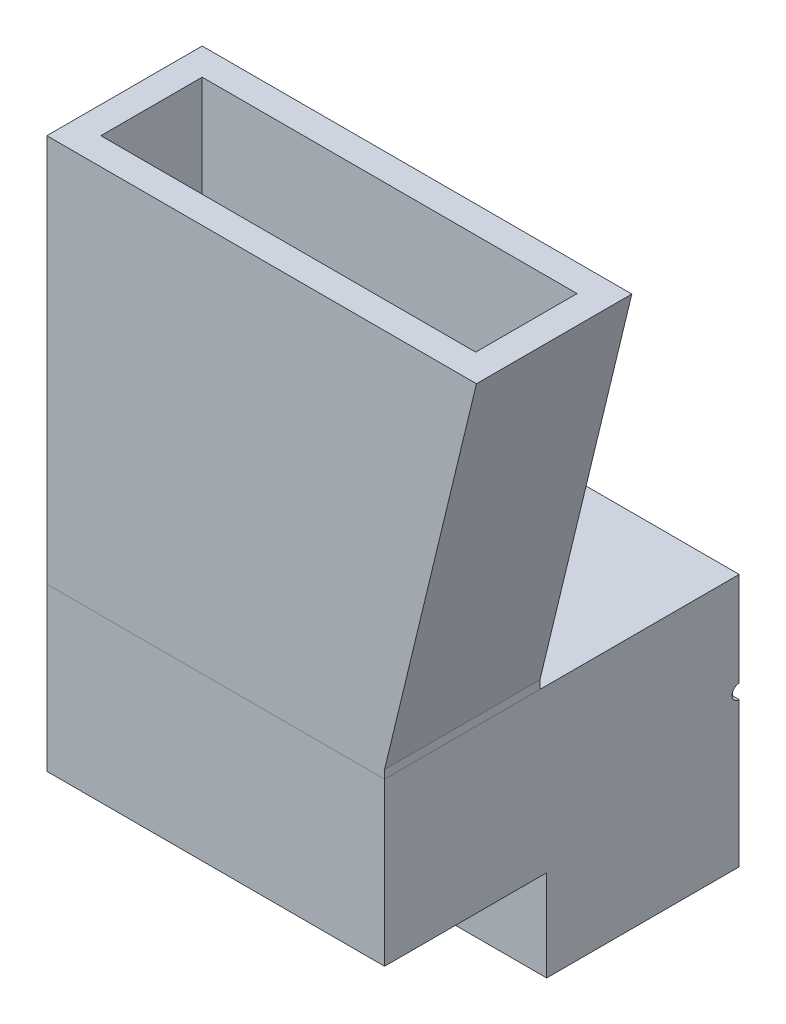
ISO-10303-21;
HEADER;
FILE_DESCRIPTION(('STEP AP214'),'2;1');
FILE_NAME('part.step','',(''),(''),'','','');
FILE_SCHEMA(('AUTOMOTIVE_DESIGN { 1 0 10303 214 1 1 1 1 }'));
ENDSEC;
DATA;
#1=APPLICATION_CONTEXT('core data for automotive mechanical design processes');
#2=APPLICATION_PROTOCOL_DEFINITION('international standard','automotive_design',2000,#1);
#3=PRODUCT_CONTEXT('',#1,'mechanical');
#4=PRODUCT('Part','Part','',(#3));
#5=PRODUCT_RELATED_PRODUCT_CATEGORY('part','',(#4));
#6=PRODUCT_DEFINITION_FORMATION('','',#4);
#7=PRODUCT_DEFINITION_CONTEXT('part definition',#1,'design');
#8=PRODUCT_DEFINITION('design','',#6,#7);
#9=PRODUCT_DEFINITION_SHAPE('','',#8);
#10=(LENGTH_UNIT() NAMED_UNIT(*) SI_UNIT(.MILLI.,.METRE.));
#11=(NAMED_UNIT(*) PLANE_ANGLE_UNIT() SI_UNIT($,.RADIAN.));
#12=(NAMED_UNIT(*) SI_UNIT($,.STERADIAN.) SOLID_ANGLE_UNIT());
#13=UNCERTAINTY_MEASURE_WITH_UNIT(LENGTH_MEASURE(1.E-05),#10,'distance_accuracy_value','');
#14=(GEOMETRIC_REPRESENTATION_CONTEXT(3) GLOBAL_UNCERTAINTY_ASSIGNED_CONTEXT((#13)) GLOBAL_UNIT_ASSIGNED_CONTEXT((#10,
#11,#12)) REPRESENTATION_CONTEXT('',''));
#15=CARTESIAN_POINT('',(0.,0.,0.));
#16=DIRECTION('',(0.,0.,1.));
#17=DIRECTION('',(1.,0.,0.));
#18=AXIS2_PLACEMENT_3D('',#15,#16,#17);
#19=CARTESIAN_POINT('',(20.,255.,0.));
#20=DIRECTION('',(0.,1.,0.));
#21=DIRECTION('',(0.,0.,1.));
#22=AXIS2_PLACEMENT_3D('',#19,#20,#21);
#23=PLANE('',#22);
#24=DIRECTION('',(-1.,0.,0.));
#25=VECTOR('',#24,1.);
#26=CARTESIAN_POINT('',(0.,255.,105.));
#27=LINE('',#26,#25);
#28=CARTESIAN_POINT('',(20.,255.,105.));
#29=VERTEX_POINT('',#28);
#30=CARTESIAN_POINT('',(-80.,255.,105.));
#31=VERTEX_POINT('',#30);
#32=EDGE_CURVE('E226',#29,#31,#27,.T.);
#33=ORIENTED_EDGE('',*,*,#32,.F.);
#34=DIRECTION('',(0.,0.,1.));
#35=VECTOR('',#34,1.);
#36=CARTESIAN_POINT('',(20.,255.,105.));
#37=LINE('',#36,#35);
#38=CARTESIAN_POINT('',(20.,255.,0.));
#39=VERTEX_POINT('',#38);
#40=EDGE_CURVE('E215',#39,#29,#37,.T.);
#41=ORIENTED_EDGE('',*,*,#40,.F.);
#42=DIRECTION('',(-1.,0.,0.));
#43=VECTOR('',#42,1.);
#44=CARTESIAN_POINT('',(-105.,255.,0.));
#45=LINE('',#44,#43);
#46=CARTESIAN_POINT('',(-80.,255.,0.));
#47=VERTEX_POINT('',#46);
#48=EDGE_CURVE('E276',#39,#47,#45,.T.);
#49=ORIENTED_EDGE('',*,*,#48,.T.);
#50=DIRECTION('',(0.,0.,1.));
#51=VECTOR('',#50,1.);
#52=CARTESIAN_POINT('',(-80.,255.,105.));
#53=LINE('',#52,#51);
#54=EDGE_CURVE('E209',#47,#31,#53,.T.);
#55=ORIENTED_EDGE('',*,*,#54,.T.);
#56=EDGE_LOOP('',(#33,#41,#49,#55));
#57=FACE_BOUND('',#56,.T.);
#58=DIRECTION('',(-1.,0.,0.));
#59=VECTOR('',#58,1.);
#60=CARTESIAN_POINT('',(-105.,255.,66.99));
#61=LINE('',#60,#59);
#62=CARTESIAN_POINT('',(12.01,255.,66.99));
#63=VERTEX_POINT('',#62);
#64=CARTESIAN_POINT('',(-72.01,255.,66.99));
#65=VERTEX_POINT('',#64);
#66=EDGE_CURVE('E195',#63,#65,#61,.T.);
#67=ORIENTED_EDGE('',*,*,#66,.F.);
#68=DIRECTION('',(0.,0.,-1.));
#69=VECTOR('',#68,1.);
#70=CARTESIAN_POINT('',(12.01,255.,105.));
#71=LINE('',#70,#69);
#72=CARTESIAN_POINT('',(12.01,255.,97.01));
#73=VERTEX_POINT('',#72);
#74=EDGE_CURVE('E182',#73,#63,#71,.T.);
#75=ORIENTED_EDGE('',*,*,#74,.F.);
#76=DIRECTION('',(-1.,0.,0.));
#77=VECTOR('',#76,1.);
#78=CARTESIAN_POINT('',(0.,255.,97.01));
#79=LINE('',#78,#77);
#80=CARTESIAN_POINT('',(-72.01,255.,97.01));
#81=VERTEX_POINT('',#80);
#82=EDGE_CURVE('E194',#73,#81,#79,.T.);
#83=ORIENTED_EDGE('',*,*,#82,.T.);
#84=DIRECTION('',(0.,0.,-1.));
#85=VECTOR('',#84,1.);
#86=CARTESIAN_POINT('',(-72.01,255.,105.));
#87=LINE('',#86,#85);
#88=EDGE_CURVE('E196',#81,#65,#87,.T.);
#89=ORIENTED_EDGE('',*,*,#88,.T.);
#90=EDGE_LOOP('',(#67,#75,#83,#89));
#91=FACE_BOUND('',#90,.T.);
#92=ADVANCED_FACE('F54',(#57,#91),#23,.T.);
#93=CARTESIAN_POINT('',(-105.,207.,49.01));
#94=DIRECTION('',(0.,0.,-1.));
#95=DIRECTION('',(0.,1.,0.));
#96=AXIS2_PLACEMENT_3D('',#93,#94,#95);
#97=PLANE('',#96);
#98=DIRECTION('',(1.,0.,0.));
#99=VECTOR('',#98,1.);
#100=CARTESIAN_POINT('',(-105.,180.,49.01));
#101=LINE('',#100,#99);
#102=CARTESIAN_POINT('',(-72.01,180.,49.01));
#103=VERTEX_POINT('',#102);
#104=CARTESIAN_POINT('',(12.01,180.,49.01));
#105=VERTEX_POINT('',#104);
#106=EDGE_CURVE('E12',#103,#105,#101,.T.);
#107=ORIENTED_EDGE('',*,*,#106,.F.);
#108=DIRECTION('',(0.,-1.,0.));
#109=VECTOR('',#108,1.);
#110=CARTESIAN_POINT('',(-72.01,0.,49.01));
#111=LINE('',#110,#109);
#112=CARTESIAN_POINT('',(-72.01,214.99,49.01));
#113=VERTEX_POINT('',#112);
#114=EDGE_CURVE('E189',#113,#103,#111,.T.);
#115=ORIENTED_EDGE('',*,*,#114,.F.);
#116=DIRECTION('',(1.,0.,0.));
#117=VECTOR('',#116,1.);
#118=CARTESIAN_POINT('',(-105.,214.99,49.01));
#119=LINE('',#118,#117);
#120=CARTESIAN_POINT('',(12.01,214.99,49.01));
#121=VERTEX_POINT('',#120);
#122=EDGE_CURVE('E247',#113,#121,#119,.T.);
#123=ORIENTED_EDGE('',*,*,#122,.T.);
#124=DIRECTION('',(0.,-1.,0.));
#125=VECTOR('',#124,1.);
#126=CARTESIAN_POINT('',(12.01,0.,49.01));
#127=LINE('',#126,#125);
#128=EDGE_CURVE('E190',#121,#105,#127,.T.);
#129=ORIENTED_EDGE('',*,*,#128,.T.);
#130=EDGE_LOOP('',(#107,#115,#123,#129));
#131=FACE_BOUND('',#130,.T.);
#132=ADVANCED_FACE('F381',(#131),#97,.T.);
#133=CARTESIAN_POINT('',(-105.,214.99,105.));
#134=DIRECTION('',(0.,1.,0.));
#135=DIRECTION('',(0.,0.,1.));
#136=AXIS2_PLACEMENT_3D('',#133,#134,#135);
#137=PLANE('',#136);
#138=DIRECTION('',(0.,0.,-1.));
#139=VECTOR('',#138,1.);
#140=CARTESIAN_POINT('',(-72.01,214.99,105.));
#141=LINE('',#140,#139);
#142=CARTESIAN_POINT('',(-72.01,214.99,97.01));
#143=VERTEX_POINT('',#142);
#144=EDGE_CURVE('E249',#143,#113,#141,.T.);
#145=ORIENTED_EDGE('',*,*,#144,.F.);
#146=DIRECTION('',(-1.,0.,0.));
#147=VECTOR('',#146,1.);
#148=CARTESIAN_POINT('',(0.,214.99,97.01));
#149=LINE('',#148,#147);
#150=CARTESIAN_POINT('',(12.01,214.99,97.01));
#151=VERTEX_POINT('',#150);
#152=EDGE_CURVE('E242',#151,#143,#149,.T.);
#153=ORIENTED_EDGE('',*,*,#152,.F.);
#154=DIRECTION('',(0.,0.,-1.));
#155=VECTOR('',#154,1.);
#156=CARTESIAN_POINT('',(12.01,214.99,105.));
#157=LINE('',#156,#155);
#158=EDGE_CURVE('E185',#151,#121,#157,.T.);
#159=ORIENTED_EDGE('',*,*,#158,.T.);
#160=ORIENTED_EDGE('',*,*,#122,.F.);
#161=EDGE_LOOP('',(#145,#153,#159,#160));
#162=FACE_BOUND('',#161,.T.);
#163=ADVANCED_FACE('F374',(#162),#137,.T.);
#164=CARTESIAN_POINT('',(18.,225.,0.));
#165=DIRECTION('',(1.,0.,0.));
#166=DIRECTION('',(0.,0.,-1.));
#167=AXIS2_PLACEMENT_3D('',#164,#165,#166);
#168=PLANE('',#167);
#169=DIRECTION('',(0.,-1.,0.));
#170=VECTOR('',#169,1.);
#171=CARTESIAN_POINT('',(18.,225.,0.));
#172=LINE('',#171,#170);
#173=CARTESIAN_POINT('',(18.,227.1,0.));
#174=VERTEX_POINT('',#173);
#175=CARTESIAN_POINT('',(18.,222.9,0.));
#176=VERTEX_POINT('',#175);
#177=EDGE_CURVE('E318',#174,#176,#172,.T.);
#178=ORIENTED_EDGE('',*,*,#177,.F.);
#179=CARTESIAN_POINT('',(18.,225.,0.));
#180=DIRECTION('',(1.,0.,0.));
#181=DIRECTION('',(0.,0.,-1.));
#182=AXIS2_PLACEMENT_3D('',#179,#180,#181);
#183=CIRCLE('',#182,2.1);
#184=EDGE_CURVE('E269',#174,#176,#183,.T.);
#185=ORIENTED_EDGE('',*,*,#184,.T.);
#186=EDGE_LOOP('',(#178,#185));
#187=FACE_BOUND('',#186,.T.);
#188=ADVANCED_FACE('F372',(#187),#168,.T.);
#189=CARTESIAN_POINT('',(18.,225.,0.));
#190=DIRECTION('',(1.,0.,0.));
#191=DIRECTION('',(0.,0.,-1.));
#192=AXIS2_PLACEMENT_3D('',#189,#190,#191);
#193=CYLINDRICAL_SURFACE('',#192,2.1);
#194=CARTESIAN_POINT('',(20.,225.,0.));
#195=DIRECTION('',(1.,0.,0.));
#196=DIRECTION('',(0.,0.,-1.));
#197=AXIS2_PLACEMENT_3D('',#194,#195,#196);
#198=CIRCLE('',#197,2.1);
#199=CARTESIAN_POINT('',(20.,227.1,0.));
#200=VERTEX_POINT('',#199);
#201=CARTESIAN_POINT('',(20.,222.9,0.));
#202=VERTEX_POINT('',#201);
#203=EDGE_CURVE('E273',#200,#202,#198,.T.);
#204=ORIENTED_EDGE('',*,*,#203,.T.);
#205=DIRECTION('',(1.,0.,0.));
#206=VECTOR('',#205,1.);
#207=CARTESIAN_POINT('',(18.,222.9,0.));
#208=LINE('',#207,#206);
#209=EDGE_CURVE('E322',#202,#176,#208,.F.);
#210=ORIENTED_EDGE('',*,*,#209,.T.);
#211=ORIENTED_EDGE('',*,*,#184,.F.);
#212=DIRECTION('',(1.,0.,0.));
#213=VECTOR('',#212,1.);
#214=CARTESIAN_POINT('',(18.,227.1,0.));
#215=LINE('',#214,#213);
#216=EDGE_CURVE('E323',#174,#200,#215,.T.);
#217=ORIENTED_EDGE('',*,*,#216,.T.);
#218=EDGE_LOOP('',(#204,#210,#211,#217));
#219=FACE_BOUND('',#218,.T.);
#220=ADVANCED_FACE('F368',(#219),#193,.F.);
#221=CARTESIAN_POINT('',(-72.01,0.,105.));
#222=DIRECTION('',(-1.,0.,0.));
#223=DIRECTION('',(0.,0.,1.));
#224=AXIS2_PLACEMENT_3D('',#221,#222,#223);
#225=PLANE('',#224);
#226=ORIENTED_EDGE('',*,*,#88,.F.);
#227=DIRECTION('',(0.,1.,0.));
#228=VECTOR('',#227,1.);
#229=CARTESIAN_POINT('',(-72.01,0.,97.01));
#230=LINE('',#229,#228);
#231=EDGE_CURVE('E200',#143,#81,#230,.T.);
#232=ORIENTED_EDGE('',*,*,#231,.F.);
#233=ORIENTED_EDGE('',*,*,#144,.T.);
#234=ORIENTED_EDGE('',*,*,#114,.T.);
#235=DIRECTION('',(0.,0.,-1.));
#236=VECTOR('',#235,1.);
#237=CARTESIAN_POINT('',(-72.01,180.,105.));
#238=LINE('',#237,#236);
#239=CARTESIAN_POINT('',(-72.01,180.,0.));
#240=VERTEX_POINT('',#239);
#241=EDGE_CURVE('E267',#103,#240,#238,.T.);
#242=ORIENTED_EDGE('',*,*,#241,.T.);
#243=DIRECTION('',(0.,1.,0.));
#244=VECTOR('',#243,1.);
#245=CARTESIAN_POINT('',(-72.01,0.,0.));
#246=LINE('',#245,#244);
#247=CARTESIAN_POINT('',(-72.01,247.01,0.));
#248=VERTEX_POINT('',#247);
#249=EDGE_CURVE('E303',#240,#248,#246,.T.);
#250=ORIENTED_EDGE('',*,*,#249,.T.);
#251=DIRECTION('',(0.,0.,1.));
#252=VECTOR('',#251,1.);
#253=CARTESIAN_POINT('',(-72.01,247.01,105.));
#254=LINE('',#253,#252);
#255=CARTESIAN_POINT('',(-72.01,247.01,66.99));
#256=VERTEX_POINT('',#255);
#257=EDGE_CURVE('E235',#248,#256,#254,.T.);
#258=ORIENTED_EDGE('',*,*,#257,.T.);
#259=DIRECTION('',(0.,1.,0.));
#260=VECTOR('',#259,1.);
#261=CARTESIAN_POINT('',(-72.01,0.,66.9900000000001));
#262=LINE('',#261,#260);
#263=EDGE_CURVE('E58',#256,#65,#262,.T.);
#264=ORIENTED_EDGE('',*,*,#263,.T.);
#265=EDGE_LOOP('',(#226,#232,#233,#234,#242,#250,#258,#264));
#266=FACE_BOUND('',#265,.T.);
#267=ADVANCED_FACE('F233',(#266),#225,.F.);
#268=CARTESIAN_POINT('',(-105.,247.01,59.));
#269=DIRECTION('',(0.,-1.,0.));
#270=DIRECTION('',(0.,0.,-1.));
#271=AXIS2_PLACEMENT_3D('',#268,#269,#270);
#272=PLANE('',#271);
#273=DIRECTION('',(-1.,0.,0.));
#274=VECTOR('',#273,1.);
#275=CARTESIAN_POINT('',(-105.,247.01,0.));
#276=LINE('',#275,#274);
#277=CARTESIAN_POINT('',(12.01,247.01,0.));
#278=VERTEX_POINT('',#277);
#279=EDGE_CURVE('E312',#278,#248,#276,.T.);
#280=ORIENTED_EDGE('',*,*,#279,.F.);
#281=DIRECTION('',(0.,0.,1.));
#282=VECTOR('',#281,1.);
#283=CARTESIAN_POINT('',(12.01,247.01,105.));
#284=LINE('',#283,#282);
#285=CARTESIAN_POINT('',(12.01,247.01,66.99));
#286=VERTEX_POINT('',#285);
#287=EDGE_CURVE('E214',#278,#286,#284,.T.);
#288=ORIENTED_EDGE('',*,*,#287,.T.);
#289=DIRECTION('',(1.,0.,0.));
#290=VECTOR('',#289,1.);
#291=CARTESIAN_POINT('',(-105.,247.01,66.99));
#292=LINE('',#291,#290);
#293=EDGE_CURVE('E237',#256,#286,#292,.T.);
#294=ORIENTED_EDGE('',*,*,#293,.F.);
#295=ORIENTED_EDGE('',*,*,#257,.F.);
#296=EDGE_LOOP('',(#280,#288,#294,#295));
#297=FACE_BOUND('',#296,.T.);
#298=ADVANCED_FACE('F407',(#297),#272,.T.);
#299=CARTESIAN_POINT('',(12.01,0.,105.));
#300=DIRECTION('',(-1.,0.,0.));
#301=DIRECTION('',(0.,0.,1.));
#302=AXIS2_PLACEMENT_3D('',#299,#300,#301);
#303=PLANE('',#302);
#304=DIRECTION('',(0.,1.,0.));
#305=VECTOR('',#304,1.);
#306=CARTESIAN_POINT('',(12.01,0.,97.01));
#307=LINE('',#306,#305);
#308=EDGE_CURVE('E178',#151,#73,#307,.T.);
#309=ORIENTED_EDGE('',*,*,#308,.T.);
#310=ORIENTED_EDGE('',*,*,#74,.T.);
#311=DIRECTION('',(0.,1.,0.));
#312=VECTOR('',#311,1.);
#313=CARTESIAN_POINT('',(12.01,0.,66.9900000000001));
#314=LINE('',#313,#312);
#315=EDGE_CURVE('E216',#286,#63,#314,.T.);
#316=ORIENTED_EDGE('',*,*,#315,.F.);
#317=ORIENTED_EDGE('',*,*,#287,.F.);
#318=DIRECTION('',(0.,1.,0.));
#319=VECTOR('',#318,1.);
#320=CARTESIAN_POINT('',(12.01,0.,0.));
#321=LINE('',#320,#319);
#322=CARTESIAN_POINT('',(12.01,235.09,0.));
#323=VERTEX_POINT('',#322);
#324=EDGE_CURVE('E315',#323,#278,#321,.T.);
#325=ORIENTED_EDGE('',*,*,#324,.F.);
#326=CARTESIAN_POINT('',(12.01,225.,0.));
#327=DIRECTION('',(-1.,0.,0.));
#328=DIRECTION('',(0.,0.,1.));
#329=AXIS2_PLACEMENT_3D('',#326,#327,#328);
#330=CIRCLE('',#329,10.09);
#331=CARTESIAN_POINT('',(12.01,214.91,0.));
#332=VERTEX_POINT('',#331);
#333=EDGE_CURVE('E236',#323,#332,#330,.F.);
#334=ORIENTED_EDGE('',*,*,#333,.T.);
#335=CARTESIAN_POINT('',(12.01,180.,0.));
#336=VERTEX_POINT('',#335);
#337=EDGE_CURVE('E308',#336,#332,#321,.T.);
#338=ORIENTED_EDGE('',*,*,#337,.F.);
#339=DIRECTION('',(0.,0.,-1.));
#340=VECTOR('',#339,1.);
#341=CARTESIAN_POINT('',(12.01,180.,105.));
#342=LINE('',#341,#340);
#343=EDGE_CURVE('E63',#105,#336,#342,.T.);
#344=ORIENTED_EDGE('',*,*,#343,.F.);
#345=ORIENTED_EDGE('',*,*,#128,.F.);
#346=ORIENTED_EDGE('',*,*,#158,.F.);
#347=EDGE_LOOP('',(#309,#310,#316,#317,#325,#334,#338,#344,#345,#346));
#348=FACE_BOUND('',#347,.T.);
#349=ADVANCED_FACE('F180',(#348),#303,.T.);
#350=CARTESIAN_POINT('',(10.01,225.,0.));
#351=DIRECTION('',(1.,0.,0.));
#352=DIRECTION('',(0.,0.,-1.));
#353=AXIS2_PLACEMENT_3D('',#350,#351,#352);
#354=PLANE('',#353);
#355=CARTESIAN_POINT('',(10.01,225.,0.));
#356=DIRECTION('',(1.,0.,0.));
#357=DIRECTION('',(0.,0.,-1.));
#358=AXIS2_PLACEMENT_3D('',#355,#356,#357);
#359=CIRCLE('',#358,10.09);
#360=CARTESIAN_POINT('',(10.01,235.09,0.));
#361=VERTEX_POINT('',#360);
#362=CARTESIAN_POINT('',(10.01,214.91,0.));
#363=VERTEX_POINT('',#362);
#364=EDGE_CURVE('E239',#361,#363,#359,.T.);
#365=ORIENTED_EDGE('',*,*,#364,.F.);
#366=DIRECTION('',(0.,-1.,0.));
#367=VECTOR('',#366,1.);
#368=CARTESIAN_POINT('',(10.01,225.,0.));
#369=LINE('',#368,#367);
#370=EDGE_CURVE('E301',#361,#363,#369,.T.);
#371=ORIENTED_EDGE('',*,*,#370,.T.);
#372=EDGE_LOOP('',(#365,#371));
#373=FACE_BOUND('',#372,.T.);
#374=ADVANCED_FACE('F300',(#373),#354,.F.);
#375=CARTESIAN_POINT('',(18.,225.,0.));
#376=DIRECTION('',(1.,0.,0.));
#377=DIRECTION('',(0.,0.,-1.));
#378=AXIS2_PLACEMENT_3D('',#375,#376,#377);
#379=CYLINDRICAL_SURFACE('',#378,10.09);
#380=DIRECTION('',(1.,0.,0.));
#381=VECTOR('',#380,1.);
#382=CARTESIAN_POINT('',(18.,214.91,0.));
#383=LINE('',#382,#381);
#384=EDGE_CURVE('E295',#332,#363,#383,.F.);
#385=ORIENTED_EDGE('',*,*,#384,.F.);
#386=ORIENTED_EDGE('',*,*,#333,.F.);
#387=DIRECTION('',(1.,0.,0.));
#388=VECTOR('',#387,1.);
#389=CARTESIAN_POINT('',(18.,235.09,0.));
#390=LINE('',#389,#388);
#391=EDGE_CURVE('E297',#361,#323,#390,.T.);
#392=ORIENTED_EDGE('',*,*,#391,.F.);
#393=ORIENTED_EDGE('',*,*,#364,.T.);
#394=EDGE_LOOP('',(#385,#386,#392,#393));
#395=FACE_BOUND('',#394,.T.);
#396=ADVANCED_FACE('F292',(#395),#379,.T.);
#397=CARTESIAN_POINT('',(-105.,207.,57.));
#398=DIRECTION('',(0.,0.,-1.));
#399=DIRECTION('',(0.,1.,0.));
#400=AXIS2_PLACEMENT_3D('',#397,#398,#399);
#401=PLANE('',#400);
#402=DIRECTION('',(0.,-1.,0.));
#403=VECTOR('',#402,1.);
#404=CARTESIAN_POINT('',(-80.,0.,57.));
#405=LINE('',#404,#403);
#406=CARTESIAN_POINT('',(-80.,207.,57.));
#407=VERTEX_POINT('',#406);
#408=CARTESIAN_POINT('',(-80.,180.,57.));
#409=VERTEX_POINT('',#408);
#410=EDGE_CURVE('E284',#407,#409,#405,.T.);
#411=ORIENTED_EDGE('',*,*,#410,.T.);
#412=DIRECTION('',(1.,0.,0.));
#413=VECTOR('',#412,1.);
#414=CARTESIAN_POINT('',(-105.,180.,57.));
#415=LINE('',#414,#413);
#416=CARTESIAN_POINT('',(20.,180.,57.));
#417=VERTEX_POINT('',#416);
#418=EDGE_CURVE('E265',#409,#417,#415,.T.);
#419=ORIENTED_EDGE('',*,*,#418,.T.);
#420=DIRECTION('',(0.,-1.,0.));
#421=VECTOR('',#420,1.);
#422=CARTESIAN_POINT('',(20.,0.,57.));
#423=LINE('',#422,#421);
#424=CARTESIAN_POINT('',(20.,207.,57.));
#425=VERTEX_POINT('',#424);
#426=EDGE_CURVE('E287',#425,#417,#423,.T.);
#427=ORIENTED_EDGE('',*,*,#426,.F.);
#428=DIRECTION('',(1.,0.,0.));
#429=VECTOR('',#428,1.);
#430=CARTESIAN_POINT('',(-105.,207.,57.));
#431=LINE('',#430,#429);
#432=EDGE_CURVE('E272',#407,#425,#431,.T.);
#433=ORIENTED_EDGE('',*,*,#432,.F.);
#434=EDGE_LOOP('',(#411,#419,#427,#433));
#435=FACE_BOUND('',#434,.T.);
#436=ADVANCED_FACE('F342',(#435),#401,.F.);
#437=CARTESIAN_POINT('',(0.,180.,0.));
#438=DIRECTION('',(0.,1.,0.));
#439=DIRECTION('',(0.,0.,1.));
#440=AXIS2_PLACEMENT_3D('',#437,#438,#439);
#441=PLANE('',#440);
#442=DIRECTION('',(0.,0.,-1.));
#443=VECTOR('',#442,1.);
#444=CARTESIAN_POINT('',(-80.,180.,105.));
#445=LINE('',#444,#443);
#446=CARTESIAN_POINT('',(-80.,180.,0.));
#447=VERTEX_POINT('',#446);
#448=EDGE_CURVE('E259',#409,#447,#445,.T.);
#449=ORIENTED_EDGE('',*,*,#448,.T.);
#450=DIRECTION('',(1.,0.,0.));
#451=VECTOR('',#450,1.);
#452=CARTESIAN_POINT('',(0.,180.,0.));
#453=LINE('',#452,#451);
#454=EDGE_CURVE('E309',#447,#240,#453,.T.);
#455=ORIENTED_EDGE('',*,*,#454,.T.);
#456=ORIENTED_EDGE('',*,*,#241,.F.);
#457=ORIENTED_EDGE('',*,*,#106,.T.);
#458=ORIENTED_EDGE('',*,*,#343,.T.);
#459=CARTESIAN_POINT('',(20.,180.,0.));
#460=VERTEX_POINT('',#459);
#461=EDGE_CURVE('E304',#336,#460,#453,.T.);
#462=ORIENTED_EDGE('',*,*,#461,.T.);
#463=DIRECTION('',(0.,0.,-1.));
#464=VECTOR('',#463,1.);
#465=CARTESIAN_POINT('',(20.,180.,105.));
#466=LINE('',#465,#464);
#467=EDGE_CURVE('E262',#417,#460,#466,.T.);
#468=ORIENTED_EDGE('',*,*,#467,.F.);
#469=ORIENTED_EDGE('',*,*,#418,.F.);
#470=EDGE_LOOP('',(#449,#455,#456,#457,#458,#462,#468,#469));
#471=FACE_BOUND('',#470,.T.);
#472=ADVANCED_FACE('F362',(#471),#441,.F.);
#473=CARTESIAN_POINT('',(0.,0.,0.));
#474=DIRECTION('',(0.,0.,1.));
#475=DIRECTION('',(1.,0.,0.));
#476=AXIS2_PLACEMENT_3D('',#473,#474,#475);
#477=PLANE('',#476);
#478=ORIENTED_EDGE('',*,*,#384,.T.);
#479=ORIENTED_EDGE('',*,*,#370,.F.);
#480=ORIENTED_EDGE('',*,*,#391,.T.);
#481=ORIENTED_EDGE('',*,*,#324,.T.);
#482=ORIENTED_EDGE('',*,*,#279,.T.);
#483=ORIENTED_EDGE('',*,*,#249,.F.);
#484=ORIENTED_EDGE('',*,*,#454,.F.);
#485=DIRECTION('',(0.,1.,0.));
#486=VECTOR('',#485,1.);
#487=CARTESIAN_POINT('',(-80.,0.,0.));
#488=LINE('',#487,#486);
#489=EDGE_CURVE('E229',#447,#47,#488,.T.);
#490=ORIENTED_EDGE('',*,*,#489,.T.);
#491=ORIENTED_EDGE('',*,*,#48,.F.);
#492=DIRECTION('',(0.,1.,0.));
#493=VECTOR('',#492,1.);
#494=CARTESIAN_POINT('',(20.,0.,0.));
#495=LINE('',#494,#493);
#496=EDGE_CURVE('E330',#200,#39,#495,.T.);
#497=ORIENTED_EDGE('',*,*,#496,.F.);
#498=ORIENTED_EDGE('',*,*,#216,.F.);
#499=ORIENTED_EDGE('',*,*,#177,.T.);
#500=ORIENTED_EDGE('',*,*,#209,.F.);
#501=EDGE_CURVE('E328',#460,#202,#495,.T.);
#502=ORIENTED_EDGE('',*,*,#501,.F.);
#503=ORIENTED_EDGE('',*,*,#461,.F.);
#504=ORIENTED_EDGE('',*,*,#337,.T.);
#505=EDGE_LOOP('',(#478,#479,#480,#481,#482,#483,#484,#490,#491,#497,#498,#499,#500,#502,#503,#504));
#506=FACE_BOUND('',#505,.T.);
#507=ADVANCED_FACE('F306',(#506),#477,.F.);
#508=CARTESIAN_POINT('',(-105.,207.,105.));
#509=DIRECTION('',(0.,1.,0.));
#510=DIRECTION('',(0.,0.,1.));
#511=AXIS2_PLACEMENT_3D('',#508,#509,#510);
#512=PLANE('',#511);
#513=DIRECTION('',(0.,0.,-1.));
#514=VECTOR('',#513,1.);
#515=CARTESIAN_POINT('',(-80.,207.,105.));
#516=LINE('',#515,#514);
#517=CARTESIAN_POINT('',(-80.,207.,105.));
#518=VERTEX_POINT('',#517);
#519=EDGE_CURVE('E282',#518,#407,#516,.T.);
#520=ORIENTED_EDGE('',*,*,#519,.T.);
#521=ORIENTED_EDGE('',*,*,#432,.T.);
#522=DIRECTION('',(0.,0.,-1.));
#523=VECTOR('',#522,1.);
#524=CARTESIAN_POINT('',(20.,207.,105.));
#525=LINE('',#524,#523);
#526=CARTESIAN_POINT('',(20.,207.,105.));
#527=VERTEX_POINT('',#526);
#528=EDGE_CURVE('E279',#527,#425,#525,.T.);
#529=ORIENTED_EDGE('',*,*,#528,.F.);
#530=DIRECTION('',(-1.,0.,0.));
#531=VECTOR('',#530,1.);
#532=CARTESIAN_POINT('',(0.,207.,105.));
#533=LINE('',#532,#531);
#534=EDGE_CURVE('E212',#527,#518,#533,.T.);
#535=ORIENTED_EDGE('',*,*,#534,.T.);
#536=EDGE_LOOP('',(#520,#521,#529,#535));
#537=FACE_BOUND('',#536,.T.);
#538=ADVANCED_FACE('F346',(#537),#512,.F.);
#539=CARTESIAN_POINT('',(-80.,0.,105.));
#540=DIRECTION('',(-1.,0.,0.));
#541=DIRECTION('',(0.,0.,1.));
#542=AXIS2_PLACEMENT_3D('',#539,#540,#541);
#543=PLANE('',#542);
#544=DIRECTION('',(0.,1.,0.));
#545=VECTOR('',#544,1.);
#546=CARTESIAN_POINT('',(-80.,0.,105.));
#547=LINE('',#546,#545);
#548=EDGE_CURVE('E205',#518,#31,#547,.T.);
#549=ORIENTED_EDGE('',*,*,#548,.T.);
#550=ORIENTED_EDGE('',*,*,#54,.F.);
#551=ORIENTED_EDGE('',*,*,#489,.F.);
#552=ORIENTED_EDGE('',*,*,#448,.F.);
#553=ORIENTED_EDGE('',*,*,#410,.F.);
#554=ORIENTED_EDGE('',*,*,#519,.F.);
#555=EDGE_LOOP('',(#549,#550,#551,#552,#553,#554));
#556=FACE_BOUND('',#555,.T.);
#557=ADVANCED_FACE('F351',(#556),#543,.T.);
#558=CARTESIAN_POINT('',(20.,0.,105.));
#559=DIRECTION('',(-1.,0.,0.));
#560=DIRECTION('',(0.,0.,1.));
#561=AXIS2_PLACEMENT_3D('',#558,#559,#560);
#562=PLANE('',#561);
#563=ORIENTED_EDGE('',*,*,#40,.T.);
#564=DIRECTION('',(0.,1.,0.));
#565=VECTOR('',#564,1.);
#566=CARTESIAN_POINT('',(20.,0.,105.));
#567=LINE('',#566,#565);
#568=EDGE_CURVE('E208',#527,#29,#567,.T.);
#569=ORIENTED_EDGE('',*,*,#568,.F.);
#570=ORIENTED_EDGE('',*,*,#528,.T.);
#571=ORIENTED_EDGE('',*,*,#426,.T.);
#572=ORIENTED_EDGE('',*,*,#467,.T.);
#573=ORIENTED_EDGE('',*,*,#501,.T.);
#574=ORIENTED_EDGE('',*,*,#203,.F.);
#575=ORIENTED_EDGE('',*,*,#496,.T.);
#576=EDGE_LOOP('',(#563,#569,#570,#571,#572,#573,#574,#575));
#577=FACE_BOUND('',#576,.T.);
#578=ADVANCED_FACE('F337',(#577),#562,.F.);
#579=CARTESIAN_POINT('',(0.,0.,105.));
#580=DIRECTION('',(0.,0.,1.));
#581=DIRECTION('',(1.,0.,0.));
#582=AXIS2_PLACEMENT_3D('',#579,#580,#581);
#583=PLANE('',#582);
#584=ORIENTED_EDGE('',*,*,#568,.T.);
#585=ORIENTED_EDGE('',*,*,#32,.T.);
#586=ORIENTED_EDGE('',*,*,#548,.F.);
#587=ORIENTED_EDGE('',*,*,#534,.F.);
#588=EDGE_LOOP('',(#584,#585,#586,#587));
#589=FACE_BOUND('',#588,.T.);
#590=ADVANCED_FACE('F354',(#589),#583,.T.);
#591=CARTESIAN_POINT('',(0.,0.,97.01));
#592=DIRECTION('',(0.,0.,1.));
#593=DIRECTION('',(1.,0.,0.));
#594=AXIS2_PLACEMENT_3D('',#591,#592,#593);
#595=PLANE('',#594);
#596=ORIENTED_EDGE('',*,*,#82,.F.);
#597=ORIENTED_EDGE('',*,*,#308,.F.);
#598=ORIENTED_EDGE('',*,*,#152,.T.);
#599=ORIENTED_EDGE('',*,*,#231,.T.);
#600=EDGE_LOOP('',(#596,#597,#598,#599));
#601=FACE_BOUND('',#600,.T.);
#602=ADVANCED_FACE('F198',(#601),#595,.F.);
#603=CARTESIAN_POINT('',(-105.,520.,66.99));
#604=DIRECTION('',(0.,0.,1.));
#605=DIRECTION('',(0.,-1.,0.));
#606=AXIS2_PLACEMENT_3D('',#603,#604,#605);
#607=PLANE('',#606);
#608=ORIENTED_EDGE('',*,*,#315,.T.);
#609=ORIENTED_EDGE('',*,*,#66,.T.);
#610=ORIENTED_EDGE('',*,*,#263,.F.);
#611=ORIENTED_EDGE('',*,*,#293,.T.);
#612=EDGE_LOOP('',(#608,#609,#610,#611));
#613=FACE_BOUND('',#612,.T.);
#614=ADVANCED_FACE('F56',(#613),#607,.T.);
#615=CLOSED_SHELL('',(#92,#132,#163,#188,#220,#267,#298,#349,#374,#396,#436,#472,#507,#538,#557,
#578,#590,#602,#614));
#616=MANIFOLD_SOLID_BREP('B2',#615);
#617=CARTESIAN_POINT('',(20.,255.,0.));
#618=DIRECTION('',(0.,1.,0.));
#619=DIRECTION('',(0.,0.,1.));
#620=AXIS2_PLACEMENT_3D('',#617,#618,#619);
#621=PLANE('',#620);
#622=DIRECTION('',(-1.,0.,0.));
#623=VECTOR('',#622,1.);
#624=CARTESIAN_POINT('',(-105.,255.,66.99));
#625=LINE('',#624,#623);
#626=CARTESIAN_POINT('',(12.01,255.,66.99));
#627=VERTEX_POINT('',#626);
#628=CARTESIAN_POINT('',(-72.01,255.,66.99));
#629=VERTEX_POINT('',#628);
#630=EDGE_CURVE('E585',#627,#629,#625,.T.);
#631=ORIENTED_EDGE('',*,*,#630,.T.);
#632=DIRECTION('',(0.,0.,-1.));
#633=VECTOR('',#632,1.);
#634=CARTESIAN_POINT('',(-72.01,255.,105.));
#635=LINE('',#634,#633);
#636=CARTESIAN_POINT('',(-72.01,255.,97.01));
#637=VERTEX_POINT('',#636);
#638=EDGE_CURVE('E705',#637,#629,#635,.T.);
#639=ORIENTED_EDGE('',*,*,#638,.F.);
#640=DIRECTION('',(-1.,0.,0.));
#641=VECTOR('',#640,1.);
#642=CARTESIAN_POINT('',(0.,255.,97.01));
#643=LINE('',#642,#641);
#644=CARTESIAN_POINT('',(12.01,255.,97.01));
#645=VERTEX_POINT('',#644);
#646=EDGE_CURVE('E668',#645,#637,#643,.T.);
#647=ORIENTED_EDGE('',*,*,#646,.F.);
#648=DIRECTION('',(0.,0.,-1.));
#649=VECTOR('',#648,1.);
#650=CARTESIAN_POINT('',(12.01,255.,105.));
#651=LINE('',#650,#649);
#652=EDGE_CURVE('E707',#645,#627,#651,.T.);
#653=ORIENTED_EDGE('',*,*,#652,.T.);
#654=EDGE_LOOP('',(#631,#639,#647,#653));
#655=FACE_BOUND('',#654,.T.);
#656=DIRECTION('',(-1.,0.,0.));
#657=VECTOR('',#656,1.);
#658=CARTESIAN_POINT('',(0.,255.,105.));
#659=LINE('',#658,#657);
#660=CARTESIAN_POINT('',(20.,255.,105.));
#661=VERTEX_POINT('',#660);
#662=CARTESIAN_POINT('',(-80.,255.,105.));
#663=VERTEX_POINT('',#662);
#664=EDGE_CURVE('E591',#661,#663,#659,.T.);
#665=ORIENTED_EDGE('',*,*,#664,.T.);
#666=DIRECTION('',(0.,0.,-1.));
#667=VECTOR('',#666,1.);
#668=CARTESIAN_POINT('',(-80.,255.,105.));
#669=LINE('',#668,#667);
#670=CARTESIAN_POINT('',(-80.,255.,59.));
#671=VERTEX_POINT('',#670);
#672=EDGE_CURVE('E697',#663,#671,#669,.T.);
#673=ORIENTED_EDGE('',*,*,#672,.T.);
#674=DIRECTION('',(1.,0.,0.));
#675=VECTOR('',#674,1.);
#676=CARTESIAN_POINT('',(-105.,255.,59.));
#677=LINE('',#676,#675);
#678=CARTESIAN_POINT('',(20.,255.,59.));
#679=VERTEX_POINT('',#678);
#680=EDGE_CURVE('E52',#671,#679,#677,.T.);
#681=ORIENTED_EDGE('',*,*,#680,.T.);
#682=DIRECTION('',(0.,0.,-1.));
#683=VECTOR('',#682,1.);
#684=CARTESIAN_POINT('',(20.,255.,105.));
#685=LINE('',#684,#683);
#686=EDGE_CURVE('E599',#661,#679,#685,.T.);
#687=ORIENTED_EDGE('',*,*,#686,.F.);
#688=EDGE_LOOP('',(#665,#673,#681,#687));
#689=FACE_BOUND('',#688,.T.);
#690=ADVANCED_FACE('F582',(#655,#689),#621,.F.);
#691=CARTESIAN_POINT('',(-47.6888596699602,11.5317898279554,105.));
#692=DIRECTION('',(-0.971985961105254,0.235038914680729,0.));
#693=DIRECTION('',(-0.235038914680729,-0.971985961105254,0.));
#694=AXIS2_PLACEMENT_3D('',#691,#692,#693);
#695=PLANE('',#694);
#696=DIRECTION('',(0.235038914680729,0.971985961105254,0.));
#697=VECTOR('',#696,1.);
#698=CARTESIAN_POINT('',(-47.6888596699602,11.5317898279554,97.01));
#699=LINE('',#698,#697);
#700=CARTESIAN_POINT('',(12.01,258.411986547786,97.01));
#701=VERTEX_POINT('',#700);
#702=CARTESIAN_POINT('',(38.993440731349,370.,97.01));
#703=VERTEX_POINT('',#702);
#704=EDGE_CURVE('E720',#701,#703,#699,.T.);
#705=ORIENTED_EDGE('',*,*,#704,.T.);
#706=DIRECTION('',(0.,0.,-1.));
#707=VECTOR('',#706,1.);
#708=CARTESIAN_POINT('',(38.993440731349,370.,105.));
#709=LINE('',#708,#707);
#710=CARTESIAN_POINT('',(38.993440731349,370.,66.99));
#711=VERTEX_POINT('',#710);
#712=EDGE_CURVE('E689',#703,#711,#709,.T.);
#713=ORIENTED_EDGE('',*,*,#712,.T.);
#714=DIRECTION('',(0.235038914680729,0.971985961105254,0.));
#715=VECTOR('',#714,1.);
#716=CARTESIAN_POINT('',(-47.6888596699602,11.5317898279554,66.9900000000001));
#717=LINE('',#716,#715);
#718=CARTESIAN_POINT('',(12.01,258.411986547786,66.99));
#719=VERTEX_POINT('',#718);
#720=EDGE_CURVE('E672',#719,#711,#717,.T.);
#721=ORIENTED_EDGE('',*,*,#720,.F.);
#722=DIRECTION('',(0.,0.,-1.));
#723=VECTOR('',#722,1.);
#724=CARTESIAN_POINT('',(12.01,258.411986547786,105.));
#725=LINE('',#724,#723);
#726=EDGE_CURVE('E733',#701,#719,#725,.T.);
#727=ORIENTED_EDGE('',*,*,#726,.F.);
#728=EDGE_LOOP('',(#705,#713,#721,#727));
#729=FACE_BOUND('',#728,.T.);
#730=ADVANCED_FACE('F788',(#729),#695,.T.);
#731=CARTESIAN_POINT('',(-80.,0.,105.));
#732=DIRECTION('',(-1.,0.,0.));
#733=DIRECTION('',(0.,0.,1.));
#734=AXIS2_PLACEMENT_3D('',#731,#732,#733);
#735=PLANE('',#734);
#736=ORIENTED_EDGE('',*,*,#672,.F.);
#737=DIRECTION('',(0.,1.,0.));
#738=VECTOR('',#737,1.);
#739=CARTESIAN_POINT('',(-80.,0.,105.));
#740=LINE('',#739,#738);
#741=CARTESIAN_POINT('',(-80.,370.,105.));
#742=VERTEX_POINT('',#741);
#743=EDGE_CURVE('E744',#663,#742,#740,.T.);
#744=ORIENTED_EDGE('',*,*,#743,.T.);
#745=DIRECTION('',(0.,0.,-1.));
#746=VECTOR('',#745,1.);
#747=CARTESIAN_POINT('',(-80.,370.,105.));
#748=LINE('',#747,#746);
#749=CARTESIAN_POINT('',(-80.,370.,59.));
#750=VERTEX_POINT('',#749);
#751=EDGE_CURVE('E755',#742,#750,#748,.T.);
#752=ORIENTED_EDGE('',*,*,#751,.T.);
#753=DIRECTION('',(0.,1.,0.));
#754=VECTOR('',#753,1.);
#755=CARTESIAN_POINT('',(-80.,0.,59.0000000000001));
#756=LINE('',#755,#754);
#757=EDGE_CURVE('E747',#671,#750,#756,.T.);
#758=ORIENTED_EDGE('',*,*,#757,.F.);
#759=EDGE_LOOP('',(#736,#744,#752,#758));
#760=FACE_BOUND('',#759,.T.);
#761=ADVANCED_FACE('F765',(#760),#735,.T.);
#762=CARTESIAN_POINT('',(0.,370.,0.));
#763=DIRECTION('',(0.,1.,0.));
#764=DIRECTION('',(0.,0.,1.));
#765=AXIS2_PLACEMENT_3D('',#762,#763,#764);
#766=PLANE('',#765);
#767=ORIENTED_EDGE('',*,*,#712,.F.);
#768=DIRECTION('',(-1.,0.,0.));
#769=VECTOR('',#768,1.);
#770=CARTESIAN_POINT('',(0.,370.,97.01));
#771=LINE('',#770,#769);
#772=CARTESIAN_POINT('',(-72.01,370.,97.01));
#773=VERTEX_POINT('',#772);
#774=EDGE_CURVE('E666',#703,#773,#771,.T.);
#775=ORIENTED_EDGE('',*,*,#774,.T.);
#776=DIRECTION('',(0.,0.,-1.));
#777=VECTOR('',#776,1.);
#778=CARTESIAN_POINT('',(-72.01,370.,105.));
#779=LINE('',#778,#777);
#780=CARTESIAN_POINT('',(-72.01,370.,66.99));
#781=VERTEX_POINT('',#780);
#782=EDGE_CURVE('E676',#773,#781,#779,.T.);
#783=ORIENTED_EDGE('',*,*,#782,.T.);
#784=DIRECTION('',(-1.,0.,0.));
#785=VECTOR('',#784,1.);
#786=CARTESIAN_POINT('',(-105.,370.,66.99));
#787=LINE('',#786,#785);
#788=EDGE_CURVE('E718',#711,#781,#787,.T.);
#789=ORIENTED_EDGE('',*,*,#788,.F.);
#790=EDGE_LOOP('',(#767,#775,#783,#789));
#791=FACE_BOUND('',#790,.T.);
#792=DIRECTION('',(-1.,0.,0.));
#793=VECTOR('',#792,1.);
#794=CARTESIAN_POINT('',(0.,370.,105.));
#795=LINE('',#794,#793);
#796=CARTESIAN_POINT('',(47.2137240684813,370.,105.));
#797=VERTEX_POINT('',#796);
#798=EDGE_CURVE('E769',#797,#742,#795,.T.);
#799=ORIENTED_EDGE('',*,*,#798,.F.);
#800=DIRECTION('',(0.,0.,-1.));
#801=VECTOR('',#800,1.);
#802=CARTESIAN_POINT('',(47.2137240684813,370.,105.));
#803=LINE('',#802,#801);
#804=CARTESIAN_POINT('',(47.2137240684813,370.,59.));
#805=VERTEX_POINT('',#804);
#806=EDGE_CURVE('E752',#797,#805,#803,.T.);
#807=ORIENTED_EDGE('',*,*,#806,.T.);
#808=DIRECTION('',(-1.,0.,0.));
#809=VECTOR('',#808,1.);
#810=CARTESIAN_POINT('',(-105.,370.,59.));
#811=LINE('',#810,#809);
#812=EDGE_CURVE('E683',#805,#750,#811,.T.);
#813=ORIENTED_EDGE('',*,*,#812,.T.);
#814=ORIENTED_EDGE('',*,*,#751,.F.);
#815=EDGE_LOOP('',(#799,#807,#813,#814));
#816=FACE_BOUND('',#815,.T.);
#817=ADVANCED_FACE('F686',(#791,#816),#766,.T.);
#818=CARTESIAN_POINT('',(-39.9226918407293,9.65382889965641,105.));
#819=DIRECTION('',(-0.971985961105254,0.235038914680729,0.));
#820=DIRECTION('',(-0.235038914680729,-0.971985961105254,0.));
#821=AXIS2_PLACEMENT_3D('',#818,#819,#820);
#822=PLANE('',#821);
#823=ORIENTED_EDGE('',*,*,#806,.F.);
#824=DIRECTION('',(0.235038914680729,0.971985961105254,0.));
#825=VECTOR('',#824,1.);
#826=CARTESIAN_POINT('',(-39.9226918407293,9.65382889965641,105.));
#827=LINE('',#826,#825);
#828=CARTESIAN_POINT('',(20.,257.459666924148,105.));
#829=VERTEX_POINT('',#828);
#830=EDGE_CURVE('E737',#829,#797,#827,.T.);
#831=ORIENTED_EDGE('',*,*,#830,.F.);
#832=DIRECTION('',(0.,0.,-1.));
#833=VECTOR('',#832,1.);
#834=CARTESIAN_POINT('',(20.,257.459666924148,105.));
#835=LINE('',#834,#833);
#836=CARTESIAN_POINT('',(20.,257.459666924148,59.));
#837=VERTEX_POINT('',#836);
#838=EDGE_CURVE('E732',#829,#837,#835,.T.);
#839=ORIENTED_EDGE('',*,*,#838,.T.);
#840=DIRECTION('',(0.235038914680729,0.971985961105254,0.));
#841=VECTOR('',#840,1.);
#842=CARTESIAN_POINT('',(-39.9226918407293,9.65382889965641,59.0000000000001));
#843=LINE('',#842,#841);
#844=EDGE_CURVE('E729',#837,#805,#843,.T.);
#845=ORIENTED_EDGE('',*,*,#844,.T.);
#846=EDGE_LOOP('',(#823,#831,#839,#845));
#847=FACE_BOUND('',#846,.T.);
#848=ADVANCED_FACE('F805',(#847),#822,.F.);
#849=CARTESIAN_POINT('',(20.,0.,105.));
#850=DIRECTION('',(-1.,0.,0.));
#851=DIRECTION('',(0.,0.,1.));
#852=AXIS2_PLACEMENT_3D('',#849,#850,#851);
#853=PLANE('',#852);
#854=DIRECTION('',(0.,1.,0.));
#855=VECTOR('',#854,1.);
#856=CARTESIAN_POINT('',(20.,0.,105.));
#857=LINE('',#856,#855);
#858=EDGE_CURVE('E741',#661,#829,#857,.T.);
#859=ORIENTED_EDGE('',*,*,#858,.F.);
#860=ORIENTED_EDGE('',*,*,#686,.T.);
#861=DIRECTION('',(0.,1.,0.));
#862=VECTOR('',#861,1.);
#863=CARTESIAN_POINT('',(20.,0.,59.0000000000001));
#864=LINE('',#863,#862);
#865=EDGE_CURVE('E702',#679,#837,#864,.T.);
#866=ORIENTED_EDGE('',*,*,#865,.T.);
#867=ORIENTED_EDGE('',*,*,#838,.F.);
#868=EDGE_LOOP('',(#859,#860,#866,#867));
#869=FACE_BOUND('',#868,.T.);
#870=ADVANCED_FACE('F807',(#869),#853,.F.);
#871=CARTESIAN_POINT('',(0.,0.,105.));
#872=DIRECTION('',(0.,0.,1.));
#873=DIRECTION('',(1.,0.,0.));
#874=AXIS2_PLACEMENT_3D('',#871,#872,#873);
#875=PLANE('',#874);
#876=ORIENTED_EDGE('',*,*,#664,.F.);
#877=ORIENTED_EDGE('',*,*,#858,.T.);
#878=ORIENTED_EDGE('',*,*,#830,.T.);
#879=ORIENTED_EDGE('',*,*,#798,.T.);
#880=ORIENTED_EDGE('',*,*,#743,.F.);
#881=EDGE_LOOP('',(#876,#877,#878,#879,#880));
#882=FACE_BOUND('',#881,.T.);
#883=ADVANCED_FACE('F811',(#882),#875,.T.);
#884=CARTESIAN_POINT('',(-105.,520.,59.));
#885=DIRECTION('',(0.,0.,1.));
#886=DIRECTION('',(0.,-1.,0.));
#887=AXIS2_PLACEMENT_3D('',#884,#885,#886);
#888=PLANE('',#887);
#889=ORIENTED_EDGE('',*,*,#812,.F.);
#890=ORIENTED_EDGE('',*,*,#844,.F.);
#891=ORIENTED_EDGE('',*,*,#865,.F.);
#892=ORIENTED_EDGE('',*,*,#680,.F.);
#893=ORIENTED_EDGE('',*,*,#757,.T.);
#894=EDGE_LOOP('',(#889,#890,#891,#892,#893));
#895=FACE_BOUND('',#894,.T.);
#896=ADVANCED_FACE('F762',(#895),#888,.F.);
#897=CARTESIAN_POINT('',(-72.01,0.,105.));
#898=DIRECTION('',(-1.,0.,0.));
#899=DIRECTION('',(0.,0.,1.));
#900=AXIS2_PLACEMENT_3D('',#897,#898,#899);
#901=PLANE('',#900);
#902=DIRECTION('',(0.,1.,0.));
#903=VECTOR('',#902,1.);
#904=CARTESIAN_POINT('',(-72.01,0.,97.01));
#905=LINE('',#904,#903);
#906=EDGE_CURVE('E660',#637,#773,#905,.T.);
#907=ORIENTED_EDGE('',*,*,#906,.F.);
#908=ORIENTED_EDGE('',*,*,#638,.T.);
#909=DIRECTION('',(0.,1.,0.));
#910=VECTOR('',#909,1.);
#911=CARTESIAN_POINT('',(-72.01,0.,66.9900000000001));
#912=LINE('',#911,#910);
#913=EDGE_CURVE('E679',#629,#781,#912,.T.);
#914=ORIENTED_EDGE('',*,*,#913,.T.);
#915=ORIENTED_EDGE('',*,*,#782,.F.);
#916=EDGE_LOOP('',(#907,#908,#914,#915));
#917=FACE_BOUND('',#916,.T.);
#918=ADVANCED_FACE('F677',(#917),#901,.F.);
#919=CARTESIAN_POINT('',(12.01,0.,105.));
#920=DIRECTION('',(-1.,0.,0.));
#921=DIRECTION('',(0.,0.,1.));
#922=AXIS2_PLACEMENT_3D('',#919,#920,#921);
#923=PLANE('',#922);
#924=ORIENTED_EDGE('',*,*,#652,.F.);
#925=DIRECTION('',(0.,1.,0.));
#926=VECTOR('',#925,1.);
#927=CARTESIAN_POINT('',(12.01,0.,97.01));
#928=LINE('',#927,#926);
#929=EDGE_CURVE('E724',#645,#701,#928,.T.);
#930=ORIENTED_EDGE('',*,*,#929,.T.);
#931=ORIENTED_EDGE('',*,*,#726,.T.);
#932=DIRECTION('',(0.,1.,0.));
#933=VECTOR('',#932,1.);
#934=CARTESIAN_POINT('',(12.01,0.,66.9900000000001));
#935=LINE('',#934,#933);
#936=EDGE_CURVE('E673',#627,#719,#935,.T.);
#937=ORIENTED_EDGE('',*,*,#936,.F.);
#938=EDGE_LOOP('',(#924,#930,#931,#937));
#939=FACE_BOUND('',#938,.T.);
#940=ADVANCED_FACE('F785',(#939),#923,.T.);
#941=CARTESIAN_POINT('',(0.,0.,97.01));
#942=DIRECTION('',(0.,0.,1.));
#943=DIRECTION('',(1.,0.,0.));
#944=AXIS2_PLACEMENT_3D('',#941,#942,#943);
#945=PLANE('',#944);
#946=ORIENTED_EDGE('',*,*,#929,.F.);
#947=ORIENTED_EDGE('',*,*,#646,.T.);
#948=ORIENTED_EDGE('',*,*,#906,.T.);
#949=ORIENTED_EDGE('',*,*,#774,.F.);
#950=ORIENTED_EDGE('',*,*,#704,.F.);
#951=EDGE_LOOP('',(#946,#947,#948,#949,#950));
#952=FACE_BOUND('',#951,.T.);
#953=ADVANCED_FACE('F663',(#952),#945,.F.);
#954=CARTESIAN_POINT('',(-105.,520.,66.99));
#955=DIRECTION('',(0.,0.,1.));
#956=DIRECTION('',(0.,-1.,0.));
#957=AXIS2_PLACEMENT_3D('',#954,#955,#956);
#958=PLANE('',#957);
#959=ORIENTED_EDGE('',*,*,#630,.F.);
#960=ORIENTED_EDGE('',*,*,#936,.T.);
#961=ORIENTED_EDGE('',*,*,#720,.T.);
#962=ORIENTED_EDGE('',*,*,#788,.T.);
#963=ORIENTED_EDGE('',*,*,#913,.F.);
#964=EDGE_LOOP('',(#959,#960,#961,#962,#963));
#965=FACE_BOUND('',#964,.T.);
#966=ADVANCED_FACE('F716',(#965),#958,.T.);
#967=CLOSED_SHELL('',(#690,#730,#761,#817,#848,#870,#883,#896,#918,#940,#953,#966));
#968=MANIFOLD_SOLID_BREP('B6',#967);
#969=ADVANCED_BREP_SHAPE_REPRESENTATION('',(#18,#616,#968),#14);
#970=SHAPE_DEFINITION_REPRESENTATION(#9,#969);
ENDSEC;
END-ISO-10303-21;
